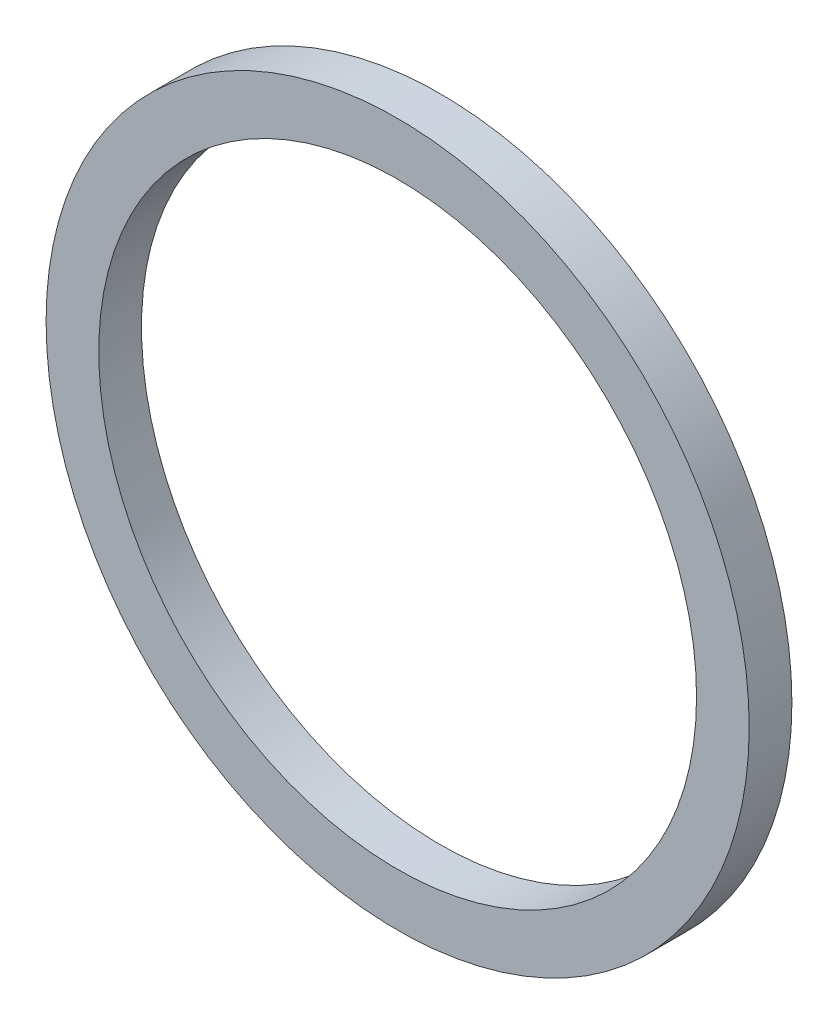
ISO-10303-21;
HEADER;
FILE_DESCRIPTION(('STEP AP214'),'2;1');
FILE_NAME('part.step','',(''),(''),'','','');
FILE_SCHEMA(('AUTOMOTIVE_DESIGN { 1 0 10303 214 1 1 1 1 }'));
ENDSEC;
DATA;
#1=APPLICATION_CONTEXT('core data for automotive mechanical design processes');
#2=APPLICATION_PROTOCOL_DEFINITION('international standard','automotive_design',2000,#1);
#3=PRODUCT_CONTEXT('',#1,'mechanical');
#4=PRODUCT('Part','Part','',(#3));
#5=PRODUCT_RELATED_PRODUCT_CATEGORY('part','',(#4));
#6=PRODUCT_DEFINITION_FORMATION('','',#4);
#7=PRODUCT_DEFINITION_CONTEXT('part definition',#1,'design');
#8=PRODUCT_DEFINITION('design','',#6,#7);
#9=PRODUCT_DEFINITION_SHAPE('','',#8);
#10=(LENGTH_UNIT() NAMED_UNIT(*) SI_UNIT(.MILLI.,.METRE.));
#11=(NAMED_UNIT(*) PLANE_ANGLE_UNIT() SI_UNIT($,.RADIAN.));
#12=(NAMED_UNIT(*) SI_UNIT($,.STERADIAN.) SOLID_ANGLE_UNIT());
#13=UNCERTAINTY_MEASURE_WITH_UNIT(LENGTH_MEASURE(1.E-05),#10,'distance_accuracy_value','');
#14=(GEOMETRIC_REPRESENTATION_CONTEXT(3) GLOBAL_UNCERTAINTY_ASSIGNED_CONTEXT((#13)) GLOBAL_UNIT_ASSIGNED_CONTEXT((#10,
#11,#12)) REPRESENTATION_CONTEXT('',''));
#15=CARTESIAN_POINT('',(0.,0.,0.));
#16=DIRECTION('',(0.,0.,1.));
#17=DIRECTION('',(1.,0.,0.));
#18=AXIS2_PLACEMENT_3D('',#15,#16,#17);
#19=CARTESIAN_POINT('',(0.,0.,3.));
#20=DIRECTION('',(0.,0.,1.));
#21=DIRECTION('',(1.,0.,0.));
#22=AXIS2_PLACEMENT_3D('',#19,#20,#21);
#23=PLANE('',#22);
#24=CARTESIAN_POINT('',(0.,0.,3.));
#25=DIRECTION('',(0.,0.,1.));
#26=DIRECTION('',(1.,0.,0.));
#27=AXIS2_PLACEMENT_3D('',#24,#25,#26);
#28=CIRCLE('',#27,24.7);
#29=CARTESIAN_POINT('',(24.7,0.,3.));
#30=VERTEX_POINT('',#29);
#31=EDGE_CURVE('E10',#30,#30,#28,.T.);
#32=ORIENTED_EDGE('',*,*,#31,.T.);
#33=EDGE_LOOP('',(#32));
#34=FACE_BOUND('',#33,.T.);
#35=CARTESIAN_POINT('',(0.,0.,3.));
#36=DIRECTION('',(0.,0.,1.));
#37=DIRECTION('',(1.,0.,0.));
#38=AXIS2_PLACEMENT_3D('',#35,#36,#37);
#39=CIRCLE('',#38,21.);
#40=CARTESIAN_POINT('',(21.,0.,3.));
#41=VERTEX_POINT('',#40);
#42=EDGE_CURVE('E41',#41,#41,#39,.T.);
#43=ORIENTED_EDGE('',*,*,#42,.F.);
#44=EDGE_LOOP('',(#43));
#45=FACE_BOUND('',#44,.T.);
#46=ADVANCED_FACE('F30',(#34,#45),#23,.T.);
#47=CARTESIAN_POINT('',(0.,0.,0.));
#48=DIRECTION('',(0.,0.,1.));
#49=DIRECTION('',(1.,0.,0.));
#50=AXIS2_PLACEMENT_3D('',#47,#48,#49);
#51=PLANE('',#50);
#52=CARTESIAN_POINT('',(0.,0.,0.));
#53=DIRECTION('',(0.,0.,1.));
#54=DIRECTION('',(1.,0.,0.));
#55=AXIS2_PLACEMENT_3D('',#52,#53,#54);
#56=CIRCLE('',#55,24.7);
#57=CARTESIAN_POINT('',(24.7,0.,0.));
#58=VERTEX_POINT('',#57);
#59=EDGE_CURVE('E34',#58,#58,#56,.T.);
#60=ORIENTED_EDGE('',*,*,#59,.F.);
#61=EDGE_LOOP('',(#60));
#62=FACE_BOUND('',#61,.T.);
#63=CARTESIAN_POINT('',(0.,0.,0.));
#64=DIRECTION('',(0.,0.,1.));
#65=DIRECTION('',(1.,0.,0.));
#66=AXIS2_PLACEMENT_3D('',#63,#64,#65);
#67=CIRCLE('',#66,21.);
#68=CARTESIAN_POINT('',(21.,0.,0.));
#69=VERTEX_POINT('',#68);
#70=EDGE_CURVE('E43',#69,#69,#67,.T.);
#71=ORIENTED_EDGE('',*,*,#70,.T.);
#72=EDGE_LOOP('',(#71));
#73=FACE_BOUND('',#72,.T.);
#74=ADVANCED_FACE('F53',(#62,#73),#51,.F.);
#75=CARTESIAN_POINT('',(0.,0.,3.));
#76=DIRECTION('',(0.,0.,-1.));
#77=DIRECTION('',(-1.,0.,0.));
#78=AXIS2_PLACEMENT_3D('',#75,#76,#77);
#79=CYLINDRICAL_SURFACE('',#78,24.7);
#80=ORIENTED_EDGE('',*,*,#31,.F.);
#81=EDGE_LOOP('',(#80));
#82=FACE_BOUND('',#81,.T.);
#83=ORIENTED_EDGE('',*,*,#59,.T.);
#84=EDGE_LOOP('',(#83));
#85=FACE_BOUND('',#84,.T.);
#86=ADVANCED_FACE('F32',(#82,#85),#79,.T.);
#87=CARTESIAN_POINT('',(0.,0.,3.));
#88=DIRECTION('',(0.,0.,-1.));
#89=DIRECTION('',(-1.,0.,0.));
#90=AXIS2_PLACEMENT_3D('',#87,#88,#89);
#91=CYLINDRICAL_SURFACE('',#90,21.);
#92=ORIENTED_EDGE('',*,*,#42,.T.);
#93=EDGE_LOOP('',(#92));
#94=FACE_BOUND('',#93,.T.);
#95=ORIENTED_EDGE('',*,*,#70,.F.);
#96=EDGE_LOOP('',(#95));
#97=FACE_BOUND('',#96,.T.);
#98=ADVANCED_FACE('F49',(#94,#97),#91,.F.);
#99=CLOSED_SHELL('',(#46,#74,#86,#98));
#100=MANIFOLD_SOLID_BREP('B2',#99);
#101=ADVANCED_BREP_SHAPE_REPRESENTATION('',(#18,#100),#14);
#102=SHAPE_DEFINITION_REPRESENTATION(#9,#101);
ENDSEC;
END-ISO-10303-21;
